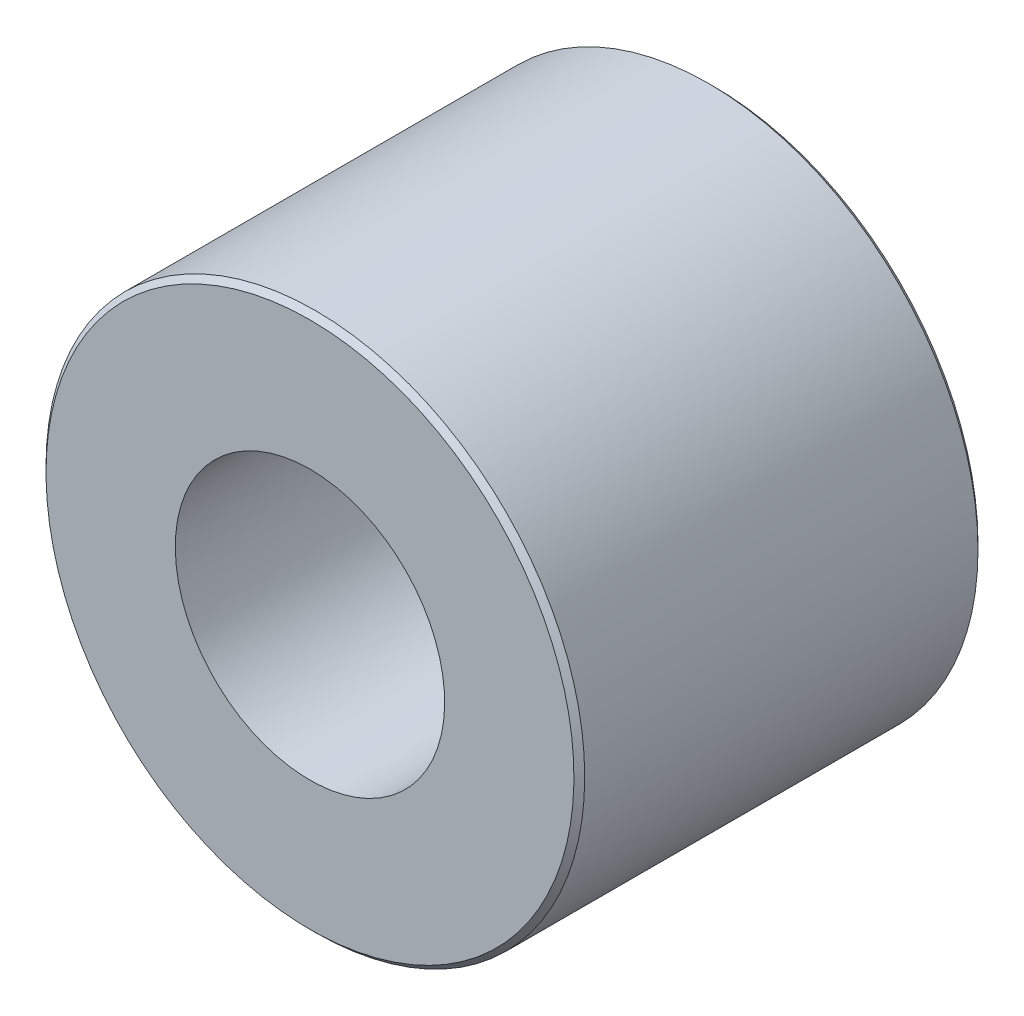
ISO-10303-21;
HEADER;
FILE_DESCRIPTION(('STEP AP214'),'2;1');
FILE_NAME('part.step','',(''),(''),'','','');
FILE_SCHEMA(('AUTOMOTIVE_DESIGN { 1 0 10303 214 1 1 1 1 }'));
ENDSEC;
DATA;
#1=APPLICATION_CONTEXT('core data for automotive mechanical design processes');
#2=APPLICATION_PROTOCOL_DEFINITION('international standard','automotive_design',2000,#1);
#3=PRODUCT_CONTEXT('',#1,'mechanical');
#4=PRODUCT('Part','Part','',(#3));
#5=PRODUCT_RELATED_PRODUCT_CATEGORY('part','',(#4));
#6=PRODUCT_DEFINITION_FORMATION('','',#4);
#7=PRODUCT_DEFINITION_CONTEXT('part definition',#1,'design');
#8=PRODUCT_DEFINITION('design','',#6,#7);
#9=PRODUCT_DEFINITION_SHAPE('','',#8);
#10=(LENGTH_UNIT() NAMED_UNIT(*) SI_UNIT(.MILLI.,.METRE.));
#11=(NAMED_UNIT(*) PLANE_ANGLE_UNIT() SI_UNIT($,.RADIAN.));
#12=(NAMED_UNIT(*) SI_UNIT($,.STERADIAN.) SOLID_ANGLE_UNIT());
#13=UNCERTAINTY_MEASURE_WITH_UNIT(LENGTH_MEASURE(1.E-05),#10,'distance_accuracy_value','');
#14=(GEOMETRIC_REPRESENTATION_CONTEXT(3) GLOBAL_UNCERTAINTY_ASSIGNED_CONTEXT((#13)) GLOBAL_UNIT_ASSIGNED_CONTEXT((#10,
#11,#12)) REPRESENTATION_CONTEXT('',''));
#15=CARTESIAN_POINT('',(0.,0.,0.));
#16=DIRECTION('',(0.,0.,1.));
#17=DIRECTION('',(1.,0.,0.));
#18=AXIS2_PLACEMENT_3D('',#15,#16,#17);
#19=CARTESIAN_POINT('',(-9.9176,-9.9176,0.));
#20=DIRECTION('',(0.,0.,1.));
#21=DIRECTION('',(1.,0.,0.));
#22=AXIS2_PLACEMENT_3D('',#19,#20,#21);
#23=PLANE('',#22);
#24=CARTESIAN_POINT('',(0.,0.,0.));
#25=DIRECTION('',(0.,0.,-1.));
#26=DIRECTION('',(0.,1.,0.));
#27=AXIS2_PLACEMENT_3D('',#24,#25,#26);
#28=CIRCLE('',#27,5.);
#29=CARTESIAN_POINT('',(0.,5.,0.));
#30=VERTEX_POINT('',#29);
#31=EDGE_CURVE('E33',#30,#30,#28,.T.);
#32=ORIENTED_EDGE('',*,*,#31,.F.);
#33=EDGE_LOOP('',(#32));
#34=FACE_BOUND('',#33,.T.);
#35=CARTESIAN_POINT('',(0.,0.,0.));
#36=DIRECTION('',(0.,0.,1.));
#37=DIRECTION('',(1.,0.,0.));
#38=AXIS2_PLACEMENT_3D('',#35,#36,#37);
#39=CIRCLE('',#38,9.8);
#40=CARTESIAN_POINT('',(9.8,0.,0.));
#41=VERTEX_POINT('',#40);
#42=EDGE_CURVE('E18',#41,#41,#39,.F.);
#43=ORIENTED_EDGE('',*,*,#42,.T.);
#44=EDGE_LOOP('',(#43));
#45=FACE_BOUND('',#44,.T.);
#46=ADVANCED_FACE('F14',(#34,#45),#23,.F.);
#47=CARTESIAN_POINT('',(0.,0.,0.));
#48=DIRECTION('',(0.,0.,1.));
#49=DIRECTION('',(1.,0.,0.));
#50=AXIS2_PLACEMENT_3D('',#47,#48,#49);
#51=CONICAL_SURFACE('',#50,9.8,0.785398163397445);
#52=CARTESIAN_POINT('',(0.,0.,0.200000000000001));
#53=DIRECTION('',(0.,0.,-1.));
#54=DIRECTION('',(-1.,0.,0.));
#55=AXIS2_PLACEMENT_3D('',#52,#53,#54);
#56=CIRCLE('',#55,10.);
#57=CARTESIAN_POINT('',(-10.,0.,0.2));
#58=VERTEX_POINT('',#57);
#59=EDGE_CURVE('E31',#58,#58,#56,.T.);
#60=ORIENTED_EDGE('',*,*,#59,.T.);
#61=EDGE_LOOP('',(#60));
#62=FACE_BOUND('',#61,.T.);
#63=ORIENTED_EDGE('',*,*,#42,.F.);
#64=EDGE_LOOP('',(#63));
#65=FACE_BOUND('',#64,.T.);
#66=ADVANCED_FACE('F42',(#62,#65),#51,.T.);
#67=CARTESIAN_POINT('',(0.,0.,15.));
#68=DIRECTION('',(0.,0.,-1.));
#69=DIRECTION('',(0.,1.,0.));
#70=AXIS2_PLACEMENT_3D('',#67,#68,#69);
#71=CYLINDRICAL_SURFACE('',#70,5.);
#72=CARTESIAN_POINT('',(0.,0.,15.));
#73=DIRECTION('',(0.,0.,-1.));
#74=DIRECTION('',(0.,1.,0.));
#75=AXIS2_PLACEMENT_3D('',#72,#73,#74);
#76=CIRCLE('',#75,5.);
#77=CARTESIAN_POINT('',(0.,5.,15.));
#78=VERTEX_POINT('',#77);
#79=EDGE_CURVE('E27',#78,#78,#76,.T.);
#80=ORIENTED_EDGE('',*,*,#79,.F.);
#81=EDGE_LOOP('',(#80));
#82=FACE_BOUND('',#81,.T.);
#83=ORIENTED_EDGE('',*,*,#31,.T.);
#84=EDGE_LOOP('',(#83));
#85=FACE_BOUND('',#84,.T.);
#86=ADVANCED_FACE('F44',(#82,#85),#71,.F.);
#87=CARTESIAN_POINT('',(0.,0.,14.8));
#88=DIRECTION('',(0.,0.,-1.));
#89=DIRECTION('',(0.,1.,0.));
#90=AXIS2_PLACEMENT_3D('',#87,#88,#89);
#91=CYLINDRICAL_SURFACE('',#90,10.);
#92=ORIENTED_EDGE('',*,*,#59,.F.);
#93=EDGE_LOOP('',(#92));
#94=FACE_BOUND('',#93,.T.);
#95=CARTESIAN_POINT('',(0.,0.,14.7999999999999));
#96=DIRECTION('',(0.,0.,-1.));
#97=DIRECTION('',(-1.,0.,0.));
#98=AXIS2_PLACEMENT_3D('',#95,#96,#97);
#99=CIRCLE('',#98,10.);
#100=CARTESIAN_POINT('',(-10.,0.,14.8));
#101=VERTEX_POINT('',#100);
#102=EDGE_CURVE('E22',#101,#101,#99,.T.);
#103=ORIENTED_EDGE('',*,*,#102,.T.);
#104=EDGE_LOOP('',(#103));
#105=FACE_BOUND('',#104,.T.);
#106=ADVANCED_FACE('F52',(#94,#105),#91,.T.);
#107=CARTESIAN_POINT('',(-9.9176,-9.9176,15.));
#108=DIRECTION('',(0.,0.,1.));
#109=DIRECTION('',(1.,0.,0.));
#110=AXIS2_PLACEMENT_3D('',#107,#108,#109);
#111=PLANE('',#110);
#112=ORIENTED_EDGE('',*,*,#79,.T.);
#113=EDGE_LOOP('',(#112));
#114=FACE_BOUND('',#113,.T.);
#115=CARTESIAN_POINT('',(0.,0.,14.9999999999999));
#116=DIRECTION('',(0.,0.,-1.));
#117=DIRECTION('',(0.,1.,0.));
#118=AXIS2_PLACEMENT_3D('',#115,#116,#117);
#119=CIRCLE('',#118,9.8000000000001);
#120=CARTESIAN_POINT('',(0.,9.8000000000001,14.9999999999999));
#121=VERTEX_POINT('',#120);
#122=EDGE_CURVE('E10',#121,#121,#119,.F.);
#123=ORIENTED_EDGE('',*,*,#122,.T.);
#124=EDGE_LOOP('',(#123));
#125=FACE_BOUND('',#124,.T.);
#126=ADVANCED_FACE('F16',(#114,#125),#111,.T.);
#127=CARTESIAN_POINT('',(0.,0.,15.));
#128=DIRECTION('',(0.,0.,-1.));
#129=DIRECTION('',(0.,1.,0.));
#130=AXIS2_PLACEMENT_3D('',#127,#128,#129);
#131=CONICAL_SURFACE('',#130,9.8,0.785398163397448);
#132=ORIENTED_EDGE('',*,*,#122,.F.);
#133=EDGE_LOOP('',(#132));
#134=FACE_BOUND('',#133,.T.);
#135=ORIENTED_EDGE('',*,*,#102,.F.);
#136=EDGE_LOOP('',(#135));
#137=FACE_BOUND('',#136,.T.);
#138=ADVANCED_FACE('F56',(#134,#137),#131,.T.);
#139=CLOSED_SHELL('',(#46,#66,#86,#106,#126,#138));
#140=MANIFOLD_SOLID_BREP('B1',#139);
#141=ADVANCED_BREP_SHAPE_REPRESENTATION('',(#18,#140),#14);
#142=SHAPE_DEFINITION_REPRESENTATION(#9,#141);
ENDSEC;
END-ISO-10303-21;
